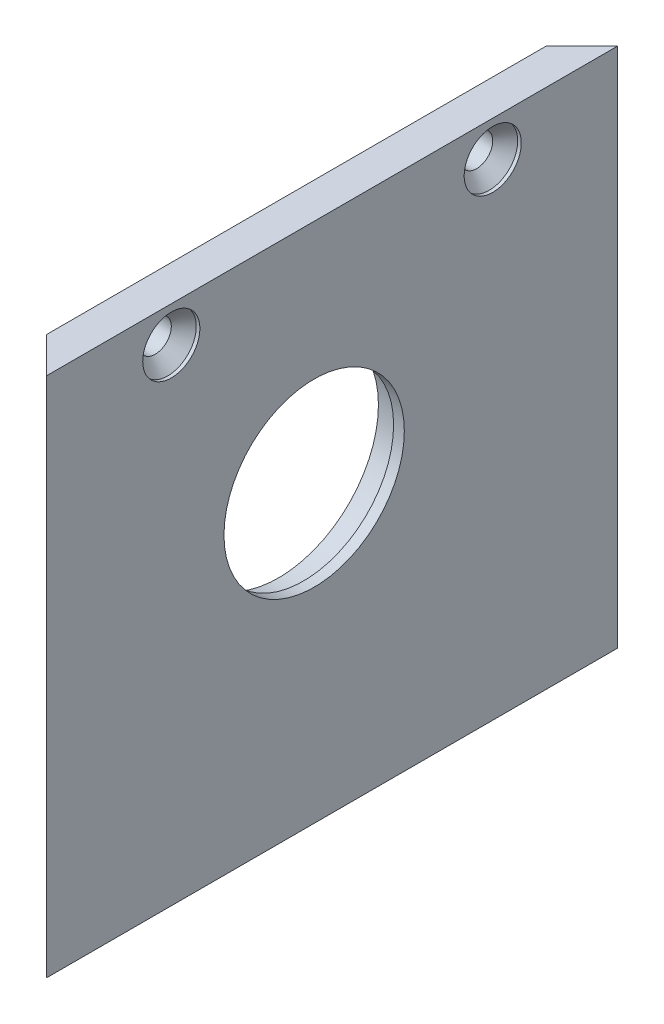
ISO-10303-21;
HEADER;
FILE_DESCRIPTION(('STEP AP214'),'2;1');
FILE_NAME('part.step','',(''),(''),'','','');
FILE_SCHEMA(('AUTOMOTIVE_DESIGN { 1 0 10303 214 1 1 1 1 }'));
ENDSEC;
DATA;
#1=APPLICATION_CONTEXT('core data for automotive mechanical design processes');
#2=APPLICATION_PROTOCOL_DEFINITION('international standard','automotive_design',2000,#1);
#3=PRODUCT_CONTEXT('',#1,'mechanical');
#4=PRODUCT('Part','Part','',(#3));
#5=PRODUCT_RELATED_PRODUCT_CATEGORY('part','',(#4));
#6=PRODUCT_DEFINITION_FORMATION('','',#4);
#7=PRODUCT_DEFINITION_CONTEXT('part definition',#1,'design');
#8=PRODUCT_DEFINITION('design','',#6,#7);
#9=PRODUCT_DEFINITION_SHAPE('','',#8);
#10=(LENGTH_UNIT() NAMED_UNIT(*) SI_UNIT(.MILLI.,.METRE.));
#11=(NAMED_UNIT(*) PLANE_ANGLE_UNIT() SI_UNIT($,.RADIAN.));
#12=(NAMED_UNIT(*) SI_UNIT($,.STERADIAN.) SOLID_ANGLE_UNIT());
#13=UNCERTAINTY_MEASURE_WITH_UNIT(LENGTH_MEASURE(1.E-05),#10,'distance_accuracy_value','');
#14=(GEOMETRIC_REPRESENTATION_CONTEXT(3) GLOBAL_UNCERTAINTY_ASSIGNED_CONTEXT((#13)) GLOBAL_UNIT_ASSIGNED_CONTEXT((#10,
#11,#12)) REPRESENTATION_CONTEXT('',''));
#15=CARTESIAN_POINT('',(0.,0.,0.));
#16=DIRECTION('',(0.,0.,1.));
#17=DIRECTION('',(1.,0.,0.));
#18=AXIS2_PLACEMENT_3D('',#15,#16,#17);
#19=CARTESIAN_POINT('',(10.,9.4999999999999,4.99999999999999));
#20=DIRECTION('',(-1.,0.,0.));
#21=DIRECTION('',(0.,0.,-1.));
#22=AXIS2_PLACEMENT_3D('',#19,#20,#21);
#23=CYLINDRICAL_SURFACE('',#22,25.25);
#24=CARTESIAN_POINT('',(10.,9.4999999999999,4.99999999999999));
#25=DIRECTION('',(1.,0.,0.));
#26=DIRECTION('',(0.,0.,-1.));
#27=AXIS2_PLACEMENT_3D('',#24,#25,#26);
#28=CIRCLE('',#27,25.25);
#29=CARTESIAN_POINT('',(10.,9.4999999999999,-20.25));
#30=VERTEX_POINT('',#29);
#31=EDGE_CURVE('E103',#30,#30,#28,.T.);
#32=ORIENTED_EDGE('',*,*,#31,.T.);
#33=EDGE_LOOP('',(#32));
#34=FACE_BOUND('',#33,.T.);
#35=CARTESIAN_POINT('',(7.,9.4999999999999,4.99999999999999));
#36=DIRECTION('',(1.,0.,0.));
#37=DIRECTION('',(0.,0.,-1.));
#38=AXIS2_PLACEMENT_3D('',#35,#36,#37);
#39=CIRCLE('',#38,25.25);
#40=CARTESIAN_POINT('',(7.,9.4999999999999,-20.25));
#41=VERTEX_POINT('',#40);
#42=EDGE_CURVE('E38',#41,#41,#39,.F.);
#43=ORIENTED_EDGE('',*,*,#42,.T.);
#44=EDGE_LOOP('',(#43));
#45=FACE_BOUND('',#44,.T.);
#46=ADVANCED_FACE('F34',(#34,#45),#23,.F.);
#47=CARTESIAN_POINT('',(10.,73.,-80.));
#48=DIRECTION('',(0.,-1.,0.));
#49=DIRECTION('',(0.,0.,1.));
#50=AXIS2_PLACEMENT_3D('',#47,#48,#49);
#51=PLANE('',#50);
#52=DIRECTION('',(0.,0.,-1.));
#53=VECTOR('',#52,1.);
#54=CARTESIAN_POINT('',(10.,73.,-80.));
#55=LINE('',#54,#53);
#56=CARTESIAN_POINT('',(10.,73.,80.));
#57=VERTEX_POINT('',#56);
#58=CARTESIAN_POINT('',(10.,73.,-80.));
#59=VERTEX_POINT('',#58);
#60=EDGE_CURVE('E83',#57,#59,#55,.T.);
#61=ORIENTED_EDGE('',*,*,#60,.T.);
#62=DIRECTION('',(-0.707106781186547,0.,0.707106781186549));
#63=VECTOR('',#62,1.);
#64=CARTESIAN_POINT('',(10.,73.,-80.));
#65=LINE('',#64,#63);
#66=CARTESIAN_POINT('',(0.,73.,-70.));
#67=VERTEX_POINT('',#66);
#68=EDGE_CURVE('E91',#67,#59,#65,.F.);
#69=ORIENTED_EDGE('',*,*,#68,.F.);
#70=DIRECTION('',(0.,0.,-1.));
#71=VECTOR('',#70,1.);
#72=CARTESIAN_POINT('',(0.,73.,-80.));
#73=LINE('',#72,#71);
#74=CARTESIAN_POINT('',(0.,73.,69.9999999999999));
#75=VERTEX_POINT('',#74);
#76=EDGE_CURVE('E90',#75,#67,#73,.T.);
#77=ORIENTED_EDGE('',*,*,#76,.F.);
#78=DIRECTION('',(0.707106781186547,0.,0.707106781186549));
#79=VECTOR('',#78,1.);
#80=CARTESIAN_POINT('',(10.,73.,80.));
#81=LINE('',#80,#79);
#82=EDGE_CURVE('E77',#57,#75,#81,.F.);
#83=ORIENTED_EDGE('',*,*,#82,.F.);
#84=EDGE_LOOP('',(#61,#69,#77,#83));
#85=FACE_BOUND('',#84,.T.);
#86=ADVANCED_FACE('F88',(#85),#51,.F.);
#87=CARTESIAN_POINT('',(10.,-73.,-80.));
#88=DIRECTION('',(0.,1.,0.));
#89=DIRECTION('',(0.,0.,-1.));
#90=AXIS2_PLACEMENT_3D('',#87,#88,#89);
#91=PLANE('',#90);
#92=DIRECTION('',(0.,0.,1.));
#93=VECTOR('',#92,1.);
#94=CARTESIAN_POINT('',(0.,-73.,-80.));
#95=LINE('',#94,#93);
#96=CARTESIAN_POINT('',(0.,-73.,-70.));
#97=VERTEX_POINT('',#96);
#98=CARTESIAN_POINT('',(0.,-73.,70.));
#99=VERTEX_POINT('',#98);
#100=EDGE_CURVE('E84',#97,#99,#95,.T.);
#101=ORIENTED_EDGE('',*,*,#100,.F.);
#102=DIRECTION('',(0.707106781186547,0.,-0.707106781186549));
#103=VECTOR('',#102,1.);
#104=CARTESIAN_POINT('',(10.,-73.,-80.));
#105=LINE('',#104,#103);
#106=CARTESIAN_POINT('',(10.,-73.,-80.));
#107=VERTEX_POINT('',#106);
#108=EDGE_CURVE('E43',#107,#97,#105,.F.);
#109=ORIENTED_EDGE('',*,*,#108,.F.);
#110=DIRECTION('',(0.,0.,1.));
#111=VECTOR('',#110,1.);
#112=CARTESIAN_POINT('',(10.,-73.,-80.));
#113=LINE('',#112,#111);
#114=CARTESIAN_POINT('',(10.,-73.,80.));
#115=VERTEX_POINT('',#114);
#116=EDGE_CURVE('E97',#107,#115,#113,.T.);
#117=ORIENTED_EDGE('',*,*,#116,.T.);
#118=DIRECTION('',(-0.707106781186547,0.,-0.707106781186549));
#119=VECTOR('',#118,1.);
#120=CARTESIAN_POINT('',(9.99999999999999,-73.,80.));
#121=LINE('',#120,#119);
#122=EDGE_CURVE('E11',#99,#115,#121,.F.);
#123=ORIENTED_EDGE('',*,*,#122,.F.);
#124=EDGE_LOOP('',(#101,#109,#117,#123));
#125=FACE_BOUND('',#124,.T.);
#126=ADVANCED_FACE('F112',(#125),#91,.F.);
#127=CARTESIAN_POINT('',(10.,0.,0.));
#128=DIRECTION('',(1.,0.,0.));
#129=DIRECTION('',(0.,0.,1.));
#130=AXIS2_PLACEMENT_3D('',#127,#128,#129);
#131=PLANE('',#130);
#132=CARTESIAN_POINT('',(10.,62.9999999999999,-45.));
#133=DIRECTION('',(-1.,0.,0.));
#134=DIRECTION('',(0.,0.,1.));
#135=AXIS2_PLACEMENT_3D('',#132,#133,#134);
#136=CIRCLE('',#135,8.00000000000001);
#137=CARTESIAN_POINT('',(10.,62.9999999999999,-37.));
#138=VERTEX_POINT('',#137);
#139=EDGE_CURVE('E175',#138,#138,#136,.T.);
#140=ORIENTED_EDGE('',*,*,#139,.T.);
#141=EDGE_LOOP('',(#140));
#142=FACE_BOUND('',#141,.T.);
#143=CARTESIAN_POINT('',(10.,62.9999999999999,45.));
#144=DIRECTION('',(-1.,0.,0.));
#145=DIRECTION('',(0.,0.,1.));
#146=AXIS2_PLACEMENT_3D('',#143,#144,#145);
#147=CIRCLE('',#146,8.00000000000001);
#148=CARTESIAN_POINT('',(10.,62.9999999999999,53.));
#149=VERTEX_POINT('',#148);
#150=EDGE_CURVE('E185',#149,#149,#147,.T.);
#151=ORIENTED_EDGE('',*,*,#150,.T.);
#152=EDGE_LOOP('',(#151));
#153=FACE_BOUND('',#152,.T.);
#154=ORIENTED_EDGE('',*,*,#31,.F.);
#155=EDGE_LOOP('',(#154));
#156=FACE_BOUND('',#155,.T.);
#157=DIRECTION('',(0.,1.,0.));
#158=VECTOR('',#157,1.);
#159=CARTESIAN_POINT('',(10.,73.,80.));
#160=LINE('',#159,#158);
#161=EDGE_CURVE('E74',#115,#57,#160,.T.);
#162=ORIENTED_EDGE('',*,*,#161,.F.);
#163=ORIENTED_EDGE('',*,*,#116,.F.);
#164=DIRECTION('',(0.,-1.,0.));
#165=VECTOR('',#164,1.);
#166=CARTESIAN_POINT('',(10.,73.,-80.));
#167=LINE('',#166,#165);
#168=EDGE_CURVE('E94',#59,#107,#167,.T.);
#169=ORIENTED_EDGE('',*,*,#168,.F.);
#170=ORIENTED_EDGE('',*,*,#60,.F.);
#171=EDGE_LOOP('',(#162,#163,#169,#170));
#172=FACE_BOUND('',#171,.T.);
#173=ADVANCED_FACE('F93',(#142,#153,#156,#172),#131,.T.);
#174=CARTESIAN_POINT('',(0.,0.,0.));
#175=DIRECTION('',(1.,0.,0.));
#176=DIRECTION('',(0.,0.,1.));
#177=AXIS2_PLACEMENT_3D('',#174,#175,#176);
#178=PLANE('',#177);
#179=CARTESIAN_POINT('',(0.,62.9999999999999,-45.));
#180=DIRECTION('',(-1.,0.,0.));
#181=DIRECTION('',(0.,0.,1.));
#182=AXIS2_PLACEMENT_3D('',#179,#180,#181);
#183=CIRCLE('',#182,4.5);
#184=CARTESIAN_POINT('',(0.,62.9999999999999,-40.5));
#185=VERTEX_POINT('',#184);
#186=EDGE_CURVE('E182',#185,#185,#183,.T.);
#187=ORIENTED_EDGE('',*,*,#186,.F.);
#188=EDGE_LOOP('',(#187));
#189=FACE_BOUND('',#188,.T.);
#190=CARTESIAN_POINT('',(0.,62.9999999999999,45.));
#191=DIRECTION('',(-1.,0.,0.));
#192=DIRECTION('',(0.,0.,1.));
#193=AXIS2_PLACEMENT_3D('',#190,#191,#192);
#194=CIRCLE('',#193,4.5);
#195=CARTESIAN_POINT('',(0.,62.9999999999999,49.5));
#196=VERTEX_POINT('',#195);
#197=EDGE_CURVE('E194',#196,#196,#194,.T.);
#198=ORIENTED_EDGE('',*,*,#197,.F.);
#199=EDGE_LOOP('',(#198));
#200=FACE_BOUND('',#199,.T.);
#201=CARTESIAN_POINT('',(0.,9.4999999999999,4.99999999999999));
#202=DIRECTION('',(1.,0.,0.));
#203=DIRECTION('',(0.,0.,-1.));
#204=AXIS2_PLACEMENT_3D('',#201,#202,#203);
#205=CIRCLE('',#204,28.);
#206=CARTESIAN_POINT('',(0.,9.4999999999999,-23.));
#207=VERTEX_POINT('',#206);
#208=EDGE_CURVE('E197',#207,#207,#205,.T.);
#209=ORIENTED_EDGE('',*,*,#208,.T.);
#210=EDGE_LOOP('',(#209));
#211=FACE_BOUND('',#210,.T.);
#212=ORIENTED_EDGE('',*,*,#76,.T.);
#213=DIRECTION('',(0.,1.,0.));
#214=VECTOR('',#213,1.);
#215=CARTESIAN_POINT('',(0.,0.,-70.));
#216=LINE('',#215,#214);
#217=EDGE_CURVE('E57',#97,#67,#216,.T.);
#218=ORIENTED_EDGE('',*,*,#217,.F.);
#219=ORIENTED_EDGE('',*,*,#100,.T.);
#220=DIRECTION('',(0.,-1.,0.));
#221=VECTOR('',#220,1.);
#222=CARTESIAN_POINT('',(0.,0.,69.9999999999999));
#223=LINE('',#222,#221);
#224=EDGE_CURVE('E49',#75,#99,#223,.T.);
#225=ORIENTED_EDGE('',*,*,#224,.F.);
#226=EDGE_LOOP('',(#212,#218,#219,#225));
#227=FACE_BOUND('',#226,.T.);
#228=ADVANCED_FACE('F113',(#189,#200,#211,#227),#178,.F.);
#229=CARTESIAN_POINT('',(10.,73.,80.));
#230=DIRECTION('',(0.707106781186549,0.,-0.707106781186547));
#231=DIRECTION('',(0.,1.,0.));
#232=AXIS2_PLACEMENT_3D('',#229,#230,#231);
#233=PLANE('',#232);
#234=ORIENTED_EDGE('',*,*,#122,.T.);
#235=ORIENTED_EDGE('',*,*,#161,.T.);
#236=ORIENTED_EDGE('',*,*,#82,.T.);
#237=ORIENTED_EDGE('',*,*,#224,.T.);
#238=EDGE_LOOP('',(#234,#235,#236,#237));
#239=FACE_BOUND('',#238,.T.);
#240=ADVANCED_FACE('F76',(#239),#233,.F.);
#241=CARTESIAN_POINT('',(10.,73.,-80.));
#242=DIRECTION('',(0.707106781186549,0.,0.707106781186547));
#243=DIRECTION('',(0.,-1.,0.));
#244=AXIS2_PLACEMENT_3D('',#241,#242,#243);
#245=PLANE('',#244);
#246=ORIENTED_EDGE('',*,*,#68,.T.);
#247=ORIENTED_EDGE('',*,*,#168,.T.);
#248=ORIENTED_EDGE('',*,*,#108,.T.);
#249=ORIENTED_EDGE('',*,*,#217,.T.);
#250=EDGE_LOOP('',(#246,#247,#248,#249));
#251=FACE_BOUND('',#250,.T.);
#252=ADVANCED_FACE('F36',(#251),#245,.F.);
#253=CARTESIAN_POINT('',(7.,9.4999999999999,4.99999999999999));
#254=DIRECTION('',(-1.,0.,0.));
#255=DIRECTION('',(0.,0.,-1.));
#256=AXIS2_PLACEMENT_3D('',#253,#254,#255);
#257=PLANE('',#256);
#258=CARTESIAN_POINT('',(7.,9.4999999999999,4.99999999999999));
#259=DIRECTION('',(1.,0.,0.));
#260=DIRECTION('',(0.,0.,-1.));
#261=AXIS2_PLACEMENT_3D('',#258,#259,#260);
#262=CIRCLE('',#261,28.);
#263=CARTESIAN_POINT('',(7.,9.4999999999999,-23.));
#264=VERTEX_POINT('',#263);
#265=EDGE_CURVE('E198',#264,#264,#262,.T.);
#266=ORIENTED_EDGE('',*,*,#265,.F.);
#267=EDGE_LOOP('',(#266));
#268=FACE_BOUND('',#267,.T.);
#269=ORIENTED_EDGE('',*,*,#42,.F.);
#270=EDGE_LOOP('',(#269));
#271=FACE_BOUND('',#270,.T.);
#272=ADVANCED_FACE('F140',(#268,#271),#257,.T.);
#273=CARTESIAN_POINT('',(7.,9.4999999999999,4.99999999999999));
#274=DIRECTION('',(-1.,0.,0.));
#275=DIRECTION('',(0.,0.,-1.));
#276=AXIS2_PLACEMENT_3D('',#273,#274,#275);
#277=CYLINDRICAL_SURFACE('',#276,28.);
#278=ORIENTED_EDGE('',*,*,#265,.T.);
#279=EDGE_LOOP('',(#278));
#280=FACE_BOUND('',#279,.T.);
#281=ORIENTED_EDGE('',*,*,#208,.F.);
#282=EDGE_LOOP('',(#281));
#283=FACE_BOUND('',#282,.T.);
#284=ADVANCED_FACE('F136',(#280,#283),#277,.F.);
#285=CARTESIAN_POINT('',(10.,62.9999999999999,45.));
#286=DIRECTION('',(1.,0.,0.));
#287=DIRECTION('',(0.,0.,1.));
#288=AXIS2_PLACEMENT_3D('',#285,#286,#287);
#289=CYLINDRICAL_SURFACE('',#288,4.5);
#290=ORIENTED_EDGE('',*,*,#197,.T.);
#291=EDGE_LOOP('',(#290));
#292=FACE_BOUND('',#291,.T.);
#293=CARTESIAN_POINT('',(5.5,62.9999999999999,45.));
#294=DIRECTION('',(-1.,0.,0.));
#295=DIRECTION('',(0.,0.,1.));
#296=AXIS2_PLACEMENT_3D('',#293,#294,#295);
#297=CIRCLE('',#296,4.5);
#298=CARTESIAN_POINT('',(5.5,62.9999999999999,49.5));
#299=VERTEX_POINT('',#298);
#300=EDGE_CURVE('E191',#299,#299,#297,.T.);
#301=ORIENTED_EDGE('',*,*,#300,.F.);
#302=EDGE_LOOP('',(#301));
#303=FACE_BOUND('',#302,.T.);
#304=ADVANCED_FACE('F139',(#292,#303),#289,.F.);
#305=CARTESIAN_POINT('',(9.,62.9999999999999,45.));
#306=DIRECTION('',(1.,0.,0.));
#307=DIRECTION('',(0.,0.,1.));
#308=AXIS2_PLACEMENT_3D('',#305,#306,#307);
#309=CONICAL_SURFACE('',#308,8.00000000000001,0.785398163397449);
#310=ORIENTED_EDGE('',*,*,#300,.T.);
#311=EDGE_LOOP('',(#310));
#312=FACE_BOUND('',#311,.T.);
#313=CARTESIAN_POINT('',(9.,62.9999999999999,45.));
#314=DIRECTION('',(-1.,0.,0.));
#315=DIRECTION('',(0.,0.,1.));
#316=AXIS2_PLACEMENT_3D('',#313,#314,#315);
#317=CIRCLE('',#316,8.00000000000001);
#318=CARTESIAN_POINT('',(9.,62.9999999999999,53.));
#319=VERTEX_POINT('',#318);
#320=EDGE_CURVE('E188',#319,#319,#317,.T.);
#321=ORIENTED_EDGE('',*,*,#320,.F.);
#322=EDGE_LOOP('',(#321));
#323=FACE_BOUND('',#322,.T.);
#324=ADVANCED_FACE('F147',(#312,#323),#309,.F.);
#325=CARTESIAN_POINT('',(10.,62.9999999999999,45.));
#326=DIRECTION('',(1.,0.,0.));
#327=DIRECTION('',(0.,0.,1.));
#328=AXIS2_PLACEMENT_3D('',#325,#326,#327);
#329=CYLINDRICAL_SURFACE('',#328,8.00000000000001);
#330=ORIENTED_EDGE('',*,*,#320,.T.);
#331=EDGE_LOOP('',(#330));
#332=FACE_BOUND('',#331,.T.);
#333=ORIENTED_EDGE('',*,*,#150,.F.);
#334=EDGE_LOOP('',(#333));
#335=FACE_BOUND('',#334,.T.);
#336=ADVANCED_FACE('F151',(#332,#335),#329,.F.);
#337=CARTESIAN_POINT('',(10.,62.9999999999999,-45.));
#338=DIRECTION('',(1.,0.,0.));
#339=DIRECTION('',(0.,0.,1.));
#340=AXIS2_PLACEMENT_3D('',#337,#338,#339);
#341=CYLINDRICAL_SURFACE('',#340,4.5);
#342=ORIENTED_EDGE('',*,*,#186,.T.);
#343=EDGE_LOOP('',(#342));
#344=FACE_BOUND('',#343,.T.);
#345=CARTESIAN_POINT('',(5.5,62.9999999999999,-45.));
#346=DIRECTION('',(-1.,0.,0.));
#347=DIRECTION('',(0.,0.,1.));
#348=AXIS2_PLACEMENT_3D('',#345,#346,#347);
#349=CIRCLE('',#348,4.5);
#350=CARTESIAN_POINT('',(5.5,62.9999999999999,-40.5));
#351=VERTEX_POINT('',#350);
#352=EDGE_CURVE('E177',#351,#351,#349,.T.);
#353=ORIENTED_EDGE('',*,*,#352,.F.);
#354=EDGE_LOOP('',(#353));
#355=FACE_BOUND('',#354,.T.);
#356=ADVANCED_FACE('F155',(#344,#355),#341,.F.);
#357=CARTESIAN_POINT('',(9.,62.9999999999999,-45.));
#358=DIRECTION('',(1.,0.,0.));
#359=DIRECTION('',(0.,0.,1.));
#360=AXIS2_PLACEMENT_3D('',#357,#358,#359);
#361=CONICAL_SURFACE('',#360,8.00000000000001,0.785398163397449);
#362=ORIENTED_EDGE('',*,*,#352,.T.);
#363=EDGE_LOOP('',(#362));
#364=FACE_BOUND('',#363,.T.);
#365=CARTESIAN_POINT('',(9.,62.9999999999999,-45.));
#366=DIRECTION('',(-1.,0.,0.));
#367=DIRECTION('',(0.,0.,1.));
#368=AXIS2_PLACEMENT_3D('',#365,#366,#367);
#369=CIRCLE('',#368,8.00000000000001);
#370=CARTESIAN_POINT('',(9.,62.9999999999999,-37.));
#371=VERTEX_POINT('',#370);
#372=EDGE_CURVE('E172',#371,#371,#369,.T.);
#373=ORIENTED_EDGE('',*,*,#372,.F.);
#374=EDGE_LOOP('',(#373));
#375=FACE_BOUND('',#374,.T.);
#376=ADVANCED_FACE('F159',(#364,#375),#361,.F.);
#377=CARTESIAN_POINT('',(10.,62.9999999999999,-45.));
#378=DIRECTION('',(1.,0.,0.));
#379=DIRECTION('',(0.,0.,1.));
#380=AXIS2_PLACEMENT_3D('',#377,#378,#379);
#381=CYLINDRICAL_SURFACE('',#380,8.00000000000001);
#382=ORIENTED_EDGE('',*,*,#372,.T.);
#383=EDGE_LOOP('',(#382));
#384=FACE_BOUND('',#383,.T.);
#385=ORIENTED_EDGE('',*,*,#139,.F.);
#386=EDGE_LOOP('',(#385));
#387=FACE_BOUND('',#386,.T.);
#388=ADVANCED_FACE('F163',(#384,#387),#381,.F.);
#389=CLOSED_SHELL('',(#46,#86,#126,#173,#228,#240,#252,#272,#284,#304,#324,#336,#356,#376,#388));
#390=MANIFOLD_SOLID_BREP('B2',#389);
#391=ADVANCED_BREP_SHAPE_REPRESENTATION('',(#18,#390),#14);
#392=SHAPE_DEFINITION_REPRESENTATION(#9,#391);
ENDSEC;
END-ISO-10303-21;
